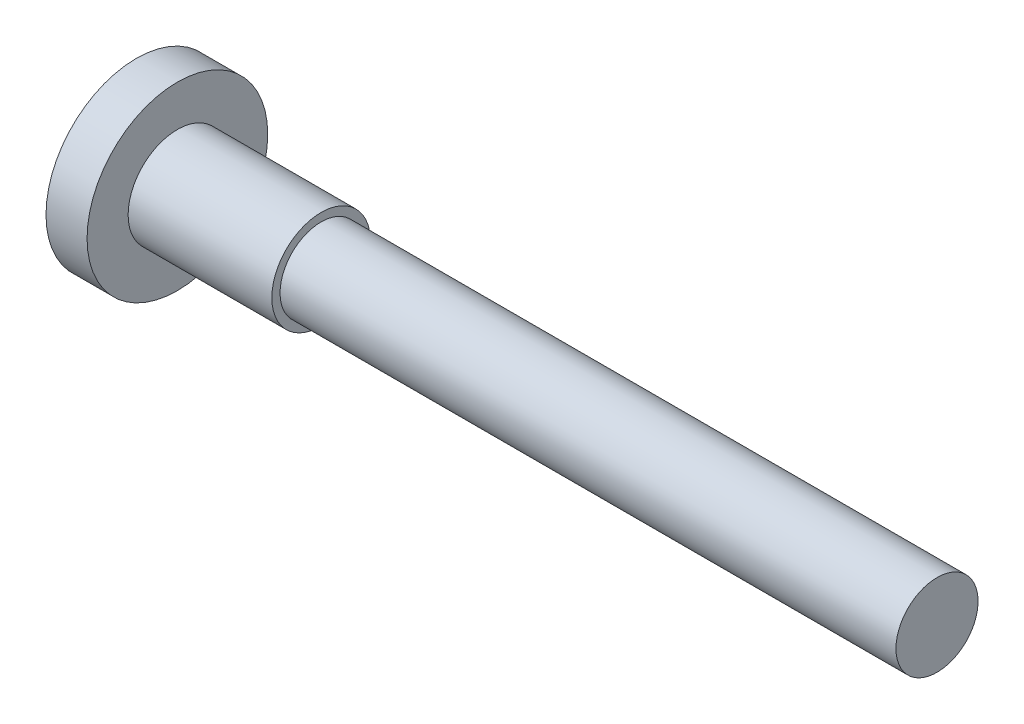
ISO-10303-21;
HEADER;
FILE_DESCRIPTION(('STEP AP214'),'2;1');
FILE_NAME('part.step','',(''),(''),'','','');
FILE_SCHEMA(('AUTOMOTIVE_DESIGN { 1 0 10303 214 1 1 1 1 }'));
ENDSEC;
DATA;
#1=APPLICATION_CONTEXT('core data for automotive mechanical design processes');
#2=APPLICATION_PROTOCOL_DEFINITION('international standard','automotive_design',2000,#1);
#3=PRODUCT_CONTEXT('',#1,'mechanical');
#4=PRODUCT('Part','Part','',(#3));
#5=PRODUCT_RELATED_PRODUCT_CATEGORY('part','',(#4));
#6=PRODUCT_DEFINITION_FORMATION('','',#4);
#7=PRODUCT_DEFINITION_CONTEXT('part definition',#1,'design');
#8=PRODUCT_DEFINITION('design','',#6,#7);
#9=PRODUCT_DEFINITION_SHAPE('','',#8);
#10=(LENGTH_UNIT() NAMED_UNIT(*) SI_UNIT(.MILLI.,.METRE.));
#11=(NAMED_UNIT(*) PLANE_ANGLE_UNIT() SI_UNIT($,.RADIAN.));
#12=(NAMED_UNIT(*) SI_UNIT($,.STERADIAN.) SOLID_ANGLE_UNIT());
#13=UNCERTAINTY_MEASURE_WITH_UNIT(LENGTH_MEASURE(1.E-05),#10,'distance_accuracy_value','');
#14=(GEOMETRIC_REPRESENTATION_CONTEXT(3) GLOBAL_UNCERTAINTY_ASSIGNED_CONTEXT((#13)) GLOBAL_UNIT_ASSIGNED_CONTEXT((#10,
#11,#12)) REPRESENTATION_CONTEXT('',''));
#15=CARTESIAN_POINT('',(0.,0.,0.));
#16=DIRECTION('',(0.,0.,1.));
#17=DIRECTION('',(1.,0.,0.));
#18=AXIS2_PLACEMENT_3D('',#15,#16,#17);
#19=CARTESIAN_POINT('',(0.,0.,0.));
#20=DIRECTION('',(1.,0.,0.));
#21=DIRECTION('',(0.,0.,-1.));
#22=AXIS2_PLACEMENT_3D('',#19,#20,#21);
#23=PLANE('',#22);
#24=CARTESIAN_POINT('',(0.,0.,0.));
#25=DIRECTION('',(-1.,0.,0.));
#26=DIRECTION('',(0.,0.,1.));
#27=AXIS2_PLACEMENT_3D('',#24,#25,#26);
#28=CIRCLE('',#27,11.);
#29=CARTESIAN_POINT('',(0.,0.,11.));
#30=VERTEX_POINT('',#29);
#31=EDGE_CURVE('E10',#30,#30,#28,.T.);
#32=ORIENTED_EDGE('',*,*,#31,.T.);
#33=EDGE_LOOP('',(#32));
#34=FACE_BOUND('',#33,.T.);
#35=ADVANCED_FACE('F33',(#34),#23,.F.);
#36=CARTESIAN_POINT('',(-49.6413078817546,0.,0.));
#37=DIRECTION('',(-1.,0.,0.));
#38=DIRECTION('',(0.,0.,1.));
#39=AXIS2_PLACEMENT_3D('',#36,#37,#38);
#40=CYLINDRICAL_SURFACE('',#39,11.);
#41=ORIENTED_EDGE('',*,*,#31,.F.);
#42=EDGE_LOOP('',(#41));
#43=FACE_BOUND('',#42,.T.);
#44=CARTESIAN_POINT('',(5.,0.,0.));
#45=DIRECTION('',(-1.,0.,0.));
#46=DIRECTION('',(0.,0.,1.));
#47=AXIS2_PLACEMENT_3D('',#44,#45,#46);
#48=CIRCLE('',#47,11.);
#49=CARTESIAN_POINT('',(5.,0.,11.));
#50=VERTEX_POINT('',#49);
#51=EDGE_CURVE('E39',#50,#50,#48,.T.);
#52=ORIENTED_EDGE('',*,*,#51,.T.);
#53=EDGE_LOOP('',(#52));
#54=FACE_BOUND('',#53,.T.);
#55=ADVANCED_FACE('F71',(#43,#54),#40,.T.);
#56=CARTESIAN_POINT('',(5.00000000000001,0.,-11.));
#57=DIRECTION('',(-1.,0.,0.));
#58=DIRECTION('',(0.,0.,1.));
#59=AXIS2_PLACEMENT_3D('',#56,#57,#58);
#60=PLANE('',#59);
#61=ORIENTED_EDGE('',*,*,#51,.F.);
#62=EDGE_LOOP('',(#61));
#63=FACE_BOUND('',#62,.T.);
#64=CARTESIAN_POINT('',(5.,0.,0.));
#65=DIRECTION('',(-1.,0.,0.));
#66=DIRECTION('',(0.,0.,1.));
#67=AXIS2_PLACEMENT_3D('',#64,#65,#66);
#68=CIRCLE('',#67,6.);
#69=CARTESIAN_POINT('',(5.,0.,6.));
#70=VERTEX_POINT('',#69);
#71=EDGE_CURVE('E43',#70,#70,#68,.T.);
#72=ORIENTED_EDGE('',*,*,#71,.T.);
#73=EDGE_LOOP('',(#72));
#74=FACE_BOUND('',#73,.T.);
#75=ADVANCED_FACE('F75',(#63,#74),#60,.F.);
#76=CARTESIAN_POINT('',(-49.6413078817546,0.,0.));
#77=DIRECTION('',(-1.,0.,0.));
#78=DIRECTION('',(0.,0.,1.));
#79=AXIS2_PLACEMENT_3D('',#76,#77,#78);
#80=CYLINDRICAL_SURFACE('',#79,6.);
#81=ORIENTED_EDGE('',*,*,#71,.F.);
#82=EDGE_LOOP('',(#81));
#83=FACE_BOUND('',#82,.T.);
#84=CARTESIAN_POINT('',(22.5,0.,0.));
#85=DIRECTION('',(-1.,0.,0.));
#86=DIRECTION('',(0.,0.,1.));
#87=AXIS2_PLACEMENT_3D('',#84,#85,#86);
#88=CIRCLE('',#87,6.);
#89=CARTESIAN_POINT('',(22.5,0.,6.));
#90=VERTEX_POINT('',#89);
#91=EDGE_CURVE('E47',#90,#90,#88,.T.);
#92=ORIENTED_EDGE('',*,*,#91,.T.);
#93=EDGE_LOOP('',(#92));
#94=FACE_BOUND('',#93,.T.);
#95=ADVANCED_FACE('F80',(#83,#94),#80,.T.);
#96=CARTESIAN_POINT('',(22.5,0.,-6.));
#97=DIRECTION('',(-1.,0.,0.));
#98=DIRECTION('',(0.,0.,1.));
#99=AXIS2_PLACEMENT_3D('',#96,#97,#98);
#100=PLANE('',#99);
#101=ORIENTED_EDGE('',*,*,#91,.F.);
#102=EDGE_LOOP('',(#101));
#103=FACE_BOUND('',#102,.T.);
#104=CARTESIAN_POINT('',(22.5,0.,0.));
#105=DIRECTION('',(-1.,0.,0.));
#106=DIRECTION('',(0.,0.,1.));
#107=AXIS2_PLACEMENT_3D('',#104,#105,#106);
#108=CIRCLE('',#107,5.);
#109=CARTESIAN_POINT('',(22.5,0.,5.));
#110=VERTEX_POINT('',#109);
#111=EDGE_CURVE('E52',#110,#110,#108,.T.);
#112=ORIENTED_EDGE('',*,*,#111,.T.);
#113=EDGE_LOOP('',(#112));
#114=FACE_BOUND('',#113,.T.);
#115=ADVANCED_FACE('F67',(#103,#114),#100,.F.);
#116=CARTESIAN_POINT('',(-49.6413078817546,0.,0.));
#117=DIRECTION('',(-1.,0.,0.));
#118=DIRECTION('',(0.,0.,1.));
#119=AXIS2_PLACEMENT_3D('',#116,#117,#118);
#120=CYLINDRICAL_SURFACE('',#119,5.);
#121=ORIENTED_EDGE('',*,*,#111,.F.);
#122=EDGE_LOOP('',(#121));
#123=FACE_BOUND('',#122,.T.);
#124=CARTESIAN_POINT('',(97.5,0.,0.));
#125=DIRECTION('',(-1.,0.,0.));
#126=DIRECTION('',(0.,0.,1.));
#127=AXIS2_PLACEMENT_3D('',#124,#125,#126);
#128=CIRCLE('',#127,5.);
#129=CARTESIAN_POINT('',(97.5,0.,5.));
#130=VERTEX_POINT('',#129);
#131=EDGE_CURVE('E55',#130,#130,#128,.T.);
#132=ORIENTED_EDGE('',*,*,#131,.T.);
#133=EDGE_LOOP('',(#132));
#134=FACE_BOUND('',#133,.T.);
#135=ADVANCED_FACE('F59',(#123,#134),#120,.T.);
#136=CARTESIAN_POINT('',(97.5,0.,-5.));
#137=DIRECTION('',(-1.,0.,0.));
#138=DIRECTION('',(0.,0.,1.));
#139=AXIS2_PLACEMENT_3D('',#136,#137,#138);
#140=PLANE('',#139);
#141=ORIENTED_EDGE('',*,*,#131,.F.);
#142=EDGE_LOOP('',(#141));
#143=FACE_BOUND('',#142,.T.);
#144=ADVANCED_FACE('F61',(#143),#140,.F.);
#145=CLOSED_SHELL('',(#35,#55,#75,#95,#115,#135,#144));
#146=MANIFOLD_SOLID_BREP('B2',#145);
#147=ADVANCED_BREP_SHAPE_REPRESENTATION('',(#18,#146),#14);
#148=SHAPE_DEFINITION_REPRESENTATION(#9,#147);
ENDSEC;
END-ISO-10303-21;
